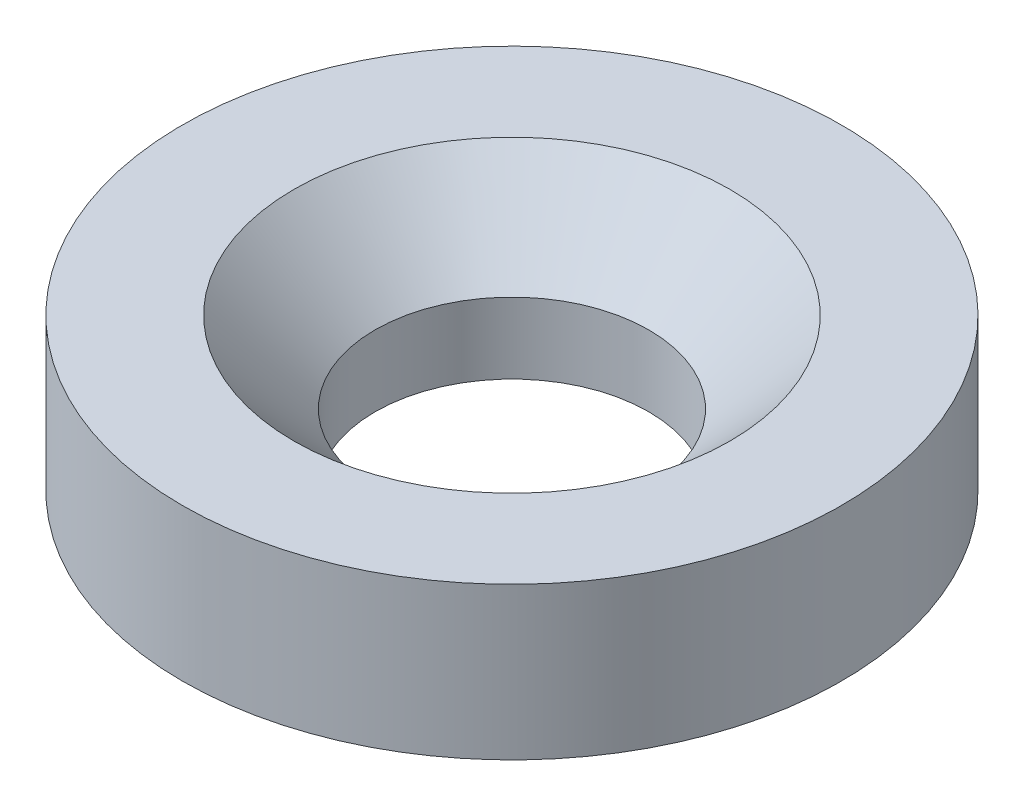
ISO-10303-21;
HEADER;
FILE_DESCRIPTION(('STEP AP214'),'2;1');
FILE_NAME('part.step','',(''),(''),'','','');
FILE_SCHEMA(('AUTOMOTIVE_DESIGN { 1 0 10303 214 1 1 1 1 }'));
ENDSEC;
DATA;
#1=APPLICATION_CONTEXT('core data for automotive mechanical design processes');
#2=APPLICATION_PROTOCOL_DEFINITION('international standard','automotive_design',2000,#1);
#3=PRODUCT_CONTEXT('',#1,'mechanical');
#4=PRODUCT('Part','Part','',(#3));
#5=PRODUCT_RELATED_PRODUCT_CATEGORY('part','',(#4));
#6=PRODUCT_DEFINITION_FORMATION('','',#4);
#7=PRODUCT_DEFINITION_CONTEXT('part definition',#1,'design');
#8=PRODUCT_DEFINITION('design','',#6,#7);
#9=PRODUCT_DEFINITION_SHAPE('','',#8);
#10=(LENGTH_UNIT() NAMED_UNIT(*) SI_UNIT(.MILLI.,.METRE.));
#11=(NAMED_UNIT(*) PLANE_ANGLE_UNIT() SI_UNIT($,.RADIAN.));
#12=(NAMED_UNIT(*) SI_UNIT($,.STERADIAN.) SOLID_ANGLE_UNIT());
#13=UNCERTAINTY_MEASURE_WITH_UNIT(LENGTH_MEASURE(1.E-05),#10,'distance_accuracy_value','');
#14=(GEOMETRIC_REPRESENTATION_CONTEXT(3) GLOBAL_UNCERTAINTY_ASSIGNED_CONTEXT((#13)) GLOBAL_UNIT_ASSIGNED_CONTEXT((#10,
#11,#12)) REPRESENTATION_CONTEXT('',''));
#15=CARTESIAN_POINT('',(0.,0.,0.));
#16=DIRECTION('',(0.,0.,1.));
#17=DIRECTION('',(1.,0.,0.));
#18=AXIS2_PLACEMENT_3D('',#15,#16,#17);
#19=CARTESIAN_POINT('',(0.,1.5,0.));
#20=DIRECTION('',(0.,-1.,0.));
#21=DIRECTION('',(0.,0.,-1.));
#22=AXIS2_PLACEMENT_3D('',#19,#20,#21);
#23=CYLINDRICAL_SURFACE('',#22,3.25);
#24=CARTESIAN_POINT('',(0.,1.5,0.));
#25=DIRECTION('',(0.,1.,0.));
#26=DIRECTION('',(0.,0.,1.));
#27=AXIS2_PLACEMENT_3D('',#24,#25,#26);
#28=CIRCLE('',#27,3.25);
#29=CARTESIAN_POINT('',(0.,1.5,3.25));
#30=VERTEX_POINT('',#29);
#31=EDGE_CURVE('E59',#30,#30,#28,.T.);
#32=ORIENTED_EDGE('',*,*,#31,.F.);
#33=EDGE_LOOP('',(#32));
#34=FACE_BOUND('',#33,.T.);
#35=CARTESIAN_POINT('',(0.,0.,0.));
#36=DIRECTION('',(0.,1.,0.));
#37=DIRECTION('',(0.,0.,1.));
#38=AXIS2_PLACEMENT_3D('',#35,#36,#37);
#39=CIRCLE('',#38,3.25);
#40=CARTESIAN_POINT('',(0.,0.,3.25));
#41=VERTEX_POINT('',#40);
#42=EDGE_CURVE('E64',#41,#41,#39,.T.);
#43=ORIENTED_EDGE('',*,*,#42,.T.);
#44=EDGE_LOOP('',(#43));
#45=FACE_BOUND('',#44,.T.);
#46=ADVANCED_FACE('F45',(#34,#45),#23,.T.);
#47=CARTESIAN_POINT('',(0.,1.5,0.));
#48=DIRECTION('',(0.,1.,0.));
#49=DIRECTION('',(0.,0.,1.));
#50=AXIS2_PLACEMENT_3D('',#47,#48,#49);
#51=PLANE('',#50);
#52=CARTESIAN_POINT('',(0.,1.5,0.));
#53=DIRECTION('',(0.,1.,0.));
#54=DIRECTION('',(0.,0.,1.));
#55=AXIS2_PLACEMENT_3D('',#52,#53,#54);
#56=CIRCLE('',#55,2.15);
#57=CARTESIAN_POINT('',(0.,1.5,2.15));
#58=VERTEX_POINT('',#57);
#59=EDGE_CURVE('E10',#58,#58,#56,.F.);
#60=ORIENTED_EDGE('',*,*,#59,.T.);
#61=EDGE_LOOP('',(#60));
#62=FACE_BOUND('',#61,.T.);
#63=ORIENTED_EDGE('',*,*,#31,.T.);
#64=EDGE_LOOP('',(#63));
#65=FACE_BOUND('',#64,.T.);
#66=ADVANCED_FACE('F79',(#62,#65),#51,.T.);
#67=CARTESIAN_POINT('',(0.,0.,0.));
#68=DIRECTION('',(0.,1.,0.));
#69=DIRECTION('',(0.,0.,1.));
#70=AXIS2_PLACEMENT_3D('',#67,#68,#69);
#71=PLANE('',#70);
#72=CARTESIAN_POINT('',(0.,0.,0.));
#73=DIRECTION('',(0.,1.,0.));
#74=DIRECTION('',(0.,0.,1.));
#75=AXIS2_PLACEMENT_3D('',#72,#73,#74);
#76=CIRCLE('',#75,1.35);
#77=CARTESIAN_POINT('',(0.,0.,1.35));
#78=VERTEX_POINT('',#77);
#79=EDGE_CURVE('E67',#78,#78,#76,.T.);
#80=ORIENTED_EDGE('',*,*,#79,.T.);
#81=EDGE_LOOP('',(#80));
#82=FACE_BOUND('',#81,.T.);
#83=ORIENTED_EDGE('',*,*,#42,.F.);
#84=EDGE_LOOP('',(#83));
#85=FACE_BOUND('',#84,.T.);
#86=ADVANCED_FACE('F76',(#82,#85),#71,.F.);
#87=CARTESIAN_POINT('',(0.,-0.5,0.));
#88=DIRECTION('',(0.,1.,0.));
#89=DIRECTION('',(0.,0.,1.));
#90=AXIS2_PLACEMENT_3D('',#87,#88,#89);
#91=CYLINDRICAL_SURFACE('',#90,1.35);
#92=CARTESIAN_POINT('',(0.,0.7,0.));
#93=DIRECTION('',(0.,1.,0.));
#94=DIRECTION('',(0.,0.,1.));
#95=AXIS2_PLACEMENT_3D('',#92,#93,#94);
#96=CIRCLE('',#95,1.35);
#97=CARTESIAN_POINT('',(0.,0.7,1.35));
#98=VERTEX_POINT('',#97);
#99=EDGE_CURVE('E54',#98,#98,#96,.T.);
#100=ORIENTED_EDGE('',*,*,#99,.T.);
#101=EDGE_LOOP('',(#100));
#102=FACE_BOUND('',#101,.T.);
#103=ORIENTED_EDGE('',*,*,#79,.F.);
#104=EDGE_LOOP('',(#103));
#105=FACE_BOUND('',#104,.T.);
#106=ADVANCED_FACE('F78',(#102,#105),#91,.F.);
#107=CARTESIAN_POINT('',(0.,0.7,0.));
#108=DIRECTION('',(0.,1.,0.));
#109=DIRECTION('',(0.,0.,1.));
#110=AXIS2_PLACEMENT_3D('',#107,#108,#109);
#111=CONICAL_SURFACE('',#110,1.35,0.78539816339745);
#112=ORIENTED_EDGE('',*,*,#59,.F.);
#113=EDGE_LOOP('',(#112));
#114=FACE_BOUND('',#113,.T.);
#115=ORIENTED_EDGE('',*,*,#99,.F.);
#116=EDGE_LOOP('',(#115));
#117=FACE_BOUND('',#116,.T.);
#118=ADVANCED_FACE('F48',(#114,#117),#111,.F.);
#119=CLOSED_SHELL('',(#46,#66,#86,#106,#118));
#120=MANIFOLD_SOLID_BREP('B2',#119);
#121=ADVANCED_BREP_SHAPE_REPRESENTATION('',(#18,#120),#14);
#122=SHAPE_DEFINITION_REPRESENTATION(#9,#121);
ENDSEC;
END-ISO-10303-21;
